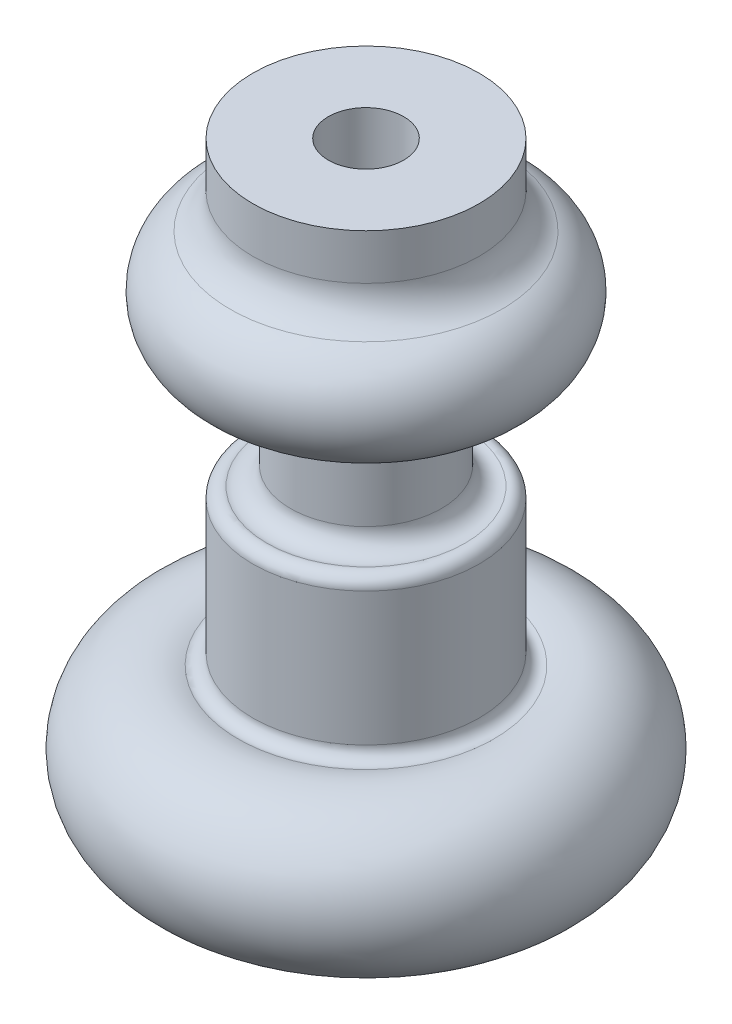
ISO-10303-21;
HEADER;
FILE_DESCRIPTION(('STEP AP214'),'2;1');
FILE_NAME('part.step','',(''),(''),'','','');
FILE_SCHEMA(('AUTOMOTIVE_DESIGN { 1 0 10303 214 1 1 1 1 }'));
ENDSEC;
DATA;
#1=APPLICATION_CONTEXT('core data for automotive mechanical design processes');
#2=APPLICATION_PROTOCOL_DEFINITION('international standard','automotive_design',2000,#1);
#3=PRODUCT_CONTEXT('',#1,'mechanical');
#4=PRODUCT('Part','Part','',(#3));
#5=PRODUCT_RELATED_PRODUCT_CATEGORY('part','',(#4));
#6=PRODUCT_DEFINITION_FORMATION('','',#4);
#7=PRODUCT_DEFINITION_CONTEXT('part definition',#1,'design');
#8=PRODUCT_DEFINITION('design','',#6,#7);
#9=PRODUCT_DEFINITION_SHAPE('','',#8);
#10=(LENGTH_UNIT() NAMED_UNIT(*) SI_UNIT(.MILLI.,.METRE.));
#11=(NAMED_UNIT(*) PLANE_ANGLE_UNIT() SI_UNIT($,.RADIAN.));
#12=(NAMED_UNIT(*) SI_UNIT($,.STERADIAN.) SOLID_ANGLE_UNIT());
#13=UNCERTAINTY_MEASURE_WITH_UNIT(LENGTH_MEASURE(1.E-05),#10,'distance_accuracy_value','');
#14=(GEOMETRIC_REPRESENTATION_CONTEXT(3) GLOBAL_UNCERTAINTY_ASSIGNED_CONTEXT((#13)) GLOBAL_UNIT_ASSIGNED_CONTEXT((#10,
#11,#12)) REPRESENTATION_CONTEXT('',''));
#15=CARTESIAN_POINT('',(0.,0.,0.));
#16=DIRECTION('',(0.,0.,1.));
#17=DIRECTION('',(1.,0.,0.));
#18=AXIS2_PLACEMENT_3D('',#15,#16,#17);
#19=CARTESIAN_POINT('',(0.,0.,0.));
#20=DIRECTION('',(0.,-1.,0.));
#21=DIRECTION('',(0.,0.,-1.));
#22=AXIS2_PLACEMENT_3D('',#19,#20,#21);
#23=PLANE('',#22);
#24=CARTESIAN_POINT('',(0.,0.,0.));
#25=DIRECTION('',(0.,-1.,0.));
#26=DIRECTION('',(0.,0.,-1.));
#27=AXIS2_PLACEMENT_3D('',#24,#25,#26);
#28=CIRCLE('',#27,40.);
#29=CARTESIAN_POINT('',(0.,0.,-40.));
#30=VERTEX_POINT('',#29);
#31=EDGE_CURVE('E10',#30,#30,#28,.T.);
#32=ORIENTED_EDGE('',*,*,#31,.T.);
#33=EDGE_LOOP('',(#32));
#34=FACE_BOUND('',#33,.T.);
#35=ADVANCED_FACE('F35',(#34),#23,.T.);
#36=CARTESIAN_POINT('',(0.,20.,0.));
#37=DIRECTION('',(0.,-1.,0.));
#38=DIRECTION('',(0.,0.,-1.));
#39=AXIS2_PLACEMENT_3D('',#36,#37,#38);
#40=TOROIDAL_SURFACE('',#39,40.,20.);
#41=CARTESIAN_POINT('',(0.,39.0512193914841,0.));
#42=DIRECTION('',(0.,-1.,0.));
#43=DIRECTION('',(0.,0.,-1.));
#44=AXIS2_PLACEMENT_3D('',#41,#42,#43);
#45=CIRCLE('',#44,33.9130434782609);
#46=CARTESIAN_POINT('',(0.,39.0512193914841,-33.9130434782609));
#47=VERTEX_POINT('',#46);
#48=EDGE_CURVE('E41',#47,#47,#45,.T.);
#49=ORIENTED_EDGE('',*,*,#48,.T.);
#50=EDGE_LOOP('',(#49));
#51=FACE_BOUND('',#50,.T.);
#52=ORIENTED_EDGE('',*,*,#31,.F.);
#53=EDGE_LOOP('',(#52));
#54=FACE_BOUND('',#53,.T.);
#55=ADVANCED_FACE('F94',(#51,#54),#40,.T.);
#56=CARTESIAN_POINT('',(0.,41.9089023002067,0.));
#57=DIRECTION('',(0.,-1.,0.));
#58=DIRECTION('',(0.,0.,-1.));
#59=AXIS2_PLACEMENT_3D('',#56,#57,#58);
#60=TOROIDAL_SURFACE('',#59,33.,3.);
#61=CARTESIAN_POINT('',(0.,41.9089023002067,0.));
#62=DIRECTION('',(0.,-1.,0.));
#63=DIRECTION('',(0.,0.,-1.));
#64=AXIS2_PLACEMENT_3D('',#61,#62,#63);
#65=CIRCLE('',#64,30.);
#66=CARTESIAN_POINT('',(0.,41.9089023002067,-30.));
#67=VERTEX_POINT('',#66);
#68=EDGE_CURVE('E45',#67,#67,#65,.T.);
#69=ORIENTED_EDGE('',*,*,#68,.T.);
#70=EDGE_LOOP('',(#69));
#71=FACE_BOUND('',#70,.T.);
#72=ORIENTED_EDGE('',*,*,#48,.F.);
#73=EDGE_LOOP('',(#72));
#74=FACE_BOUND('',#73,.T.);
#75=ADVANCED_FACE('F98',(#71,#74),#60,.F.);
#76=CARTESIAN_POINT('',(0.,0.,0.));
#77=DIRECTION('',(0.,-1.,0.));
#78=DIRECTION('',(0.,0.,-1.));
#79=AXIS2_PLACEMENT_3D('',#76,#77,#78);
#80=CYLINDRICAL_SURFACE('',#79,30.);
#81=CARTESIAN_POINT('',(0.,77.2540333075852,0.));
#82=DIRECTION('',(0.,-1.,0.));
#83=DIRECTION('',(0.,0.,-1.));
#84=AXIS2_PLACEMENT_3D('',#81,#82,#83);
#85=CIRCLE('',#84,30.);
#86=CARTESIAN_POINT('',(0.,77.2540333075852,-30.));
#87=VERTEX_POINT('',#86);
#88=EDGE_CURVE('E49',#87,#87,#85,.T.);
#89=ORIENTED_EDGE('',*,*,#88,.T.);
#90=EDGE_LOOP('',(#89));
#91=FACE_BOUND('',#90,.T.);
#92=ORIENTED_EDGE('',*,*,#68,.F.);
#93=EDGE_LOOP('',(#92));
#94=FACE_BOUND('',#93,.T.);
#95=ADVANCED_FACE('F102',(#91,#94),#80,.T.);
#96=CARTESIAN_POINT('',(0.,77.2540333075852,0.));
#97=DIRECTION('',(0.,-1.,0.));
#98=DIRECTION('',(0.,0.,-1.));
#99=AXIS2_PLACEMENT_3D('',#96,#97,#98);
#100=TOROIDAL_SURFACE('',#99,27.,3.);
#101=CARTESIAN_POINT('',(0.,80.1587708172407,0.));
#102=DIRECTION('',(0.,-1.,0.));
#103=DIRECTION('',(0.,0.,-1.));
#104=AXIS2_PLACEMENT_3D('',#101,#102,#103);
#105=CIRCLE('',#104,26.25);
#106=CARTESIAN_POINT('',(0.,80.1587708172407,-26.25));
#107=VERTEX_POINT('',#106);
#108=EDGE_CURVE('E54',#107,#107,#105,.T.);
#109=ORIENTED_EDGE('',*,*,#108,.T.);
#110=EDGE_LOOP('',(#109));
#111=FACE_BOUND('',#110,.T.);
#112=ORIENTED_EDGE('',*,*,#88,.F.);
#113=EDGE_LOOP('',(#112));
#114=FACE_BOUND('',#113,.T.);
#115=ADVANCED_FACE('F109',(#111,#114),#100,.T.);
#116=CARTESIAN_POINT('',(0.,85.,0.));
#117=DIRECTION('',(0.,-1.,0.));
#118=DIRECTION('',(0.,0.,-1.));
#119=AXIS2_PLACEMENT_3D('',#116,#117,#118);
#120=TOROIDAL_SURFACE('',#119,25.,5.);
#121=CARTESIAN_POINT('',(0.,85.,0.));
#122=DIRECTION('',(0.,-1.,0.));
#123=DIRECTION('',(0.,0.,-1.));
#124=AXIS2_PLACEMENT_3D('',#121,#122,#123);
#125=CIRCLE('',#124,20.);
#126=CARTESIAN_POINT('',(0.,85.,-20.));
#127=VERTEX_POINT('',#126);
#128=EDGE_CURVE('E57',#127,#127,#125,.T.);
#129=ORIENTED_EDGE('',*,*,#128,.T.);
#130=EDGE_LOOP('',(#129));
#131=FACE_BOUND('',#130,.T.);
#132=ORIENTED_EDGE('',*,*,#108,.F.);
#133=EDGE_LOOP('',(#132));
#134=FACE_BOUND('',#133,.T.);
#135=ADVANCED_FACE('F113',(#131,#134),#120,.F.);
#136=CARTESIAN_POINT('',(0.,0.,0.));
#137=DIRECTION('',(0.,-1.,0.));
#138=DIRECTION('',(0.,0.,-1.));
#139=AXIS2_PLACEMENT_3D('',#136,#137,#138);
#140=CYLINDRICAL_SURFACE('',#139,20.);
#141=CARTESIAN_POINT('',(0.,100.,0.));
#142=DIRECTION('',(0.,-1.,0.));
#143=DIRECTION('',(0.,0.,-1.));
#144=AXIS2_PLACEMENT_3D('',#141,#142,#143);
#145=CIRCLE('',#144,20.);
#146=CARTESIAN_POINT('',(0.,100.,-20.));
#147=VERTEX_POINT('',#146);
#148=EDGE_CURVE('E60',#147,#147,#145,.T.);
#149=ORIENTED_EDGE('',*,*,#148,.T.);
#150=EDGE_LOOP('',(#149));
#151=FACE_BOUND('',#150,.T.);
#152=ORIENTED_EDGE('',*,*,#128,.F.);
#153=EDGE_LOOP('',(#152));
#154=FACE_BOUND('',#153,.T.);
#155=ADVANCED_FACE('F117',(#151,#154),#140,.T.);
#156=CARTESIAN_POINT('',(0.,100.,0.));
#157=DIRECTION('',(0.,-1.,0.));
#158=DIRECTION('',(0.,0.,-1.));
#159=AXIS2_PLACEMENT_3D('',#156,#157,#158);
#160=TOROIDAL_SURFACE('',#159,30.,10.);
#161=CARTESIAN_POINT('',(0.,110.,0.));
#162=DIRECTION('',(0.,-1.,0.));
#163=DIRECTION('',(0.,0.,-1.));
#164=AXIS2_PLACEMENT_3D('',#161,#162,#163);
#165=CIRCLE('',#164,30.);
#166=CARTESIAN_POINT('',(0.,110.,-30.));
#167=VERTEX_POINT('',#166);
#168=EDGE_CURVE('E63',#167,#167,#165,.T.);
#169=ORIENTED_EDGE('',*,*,#168,.T.);
#170=EDGE_LOOP('',(#169));
#171=FACE_BOUND('',#170,.T.);
#172=ORIENTED_EDGE('',*,*,#148,.F.);
#173=EDGE_LOOP('',(#172));
#174=FACE_BOUND('',#173,.T.);
#175=ADVANCED_FACE('F121',(#171,#174),#160,.F.);
#176=CARTESIAN_POINT('',(0.,125.,0.));
#177=DIRECTION('',(0.,-1.,0.));
#178=DIRECTION('',(0.,0.,-1.));
#179=AXIS2_PLACEMENT_3D('',#176,#177,#178);
#180=TOROIDAL_SURFACE('',#179,30.,15.);
#181=CARTESIAN_POINT('',(0.,138.747727084868,0.));
#182=DIRECTION('',(0.,-1.,0.));
#183=DIRECTION('',(0.,0.,-1.));
#184=AXIS2_PLACEMENT_3D('',#181,#182,#183);
#185=CIRCLE('',#184,36.);
#186=CARTESIAN_POINT('',(0.,138.747727084868,-36.));
#187=VERTEX_POINT('',#186);
#188=EDGE_CURVE('E66',#187,#187,#185,.T.);
#189=ORIENTED_EDGE('',*,*,#188,.T.);
#190=EDGE_LOOP('',(#189));
#191=FACE_BOUND('',#190,.T.);
#192=ORIENTED_EDGE('',*,*,#168,.F.);
#193=EDGE_LOOP('',(#192));
#194=FACE_BOUND('',#193,.T.);
#195=ADVANCED_FACE('F125',(#191,#194),#180,.T.);
#196=CARTESIAN_POINT('',(0.,147.912878474779,0.));
#197=DIRECTION('',(0.,-1.,0.));
#198=DIRECTION('',(0.,0.,-1.));
#199=AXIS2_PLACEMENT_3D('',#196,#197,#198);
#200=TOROIDAL_SURFACE('',#199,40.,10.);
#201=CARTESIAN_POINT('',(0.,147.912878474779,0.));
#202=DIRECTION('',(0.,-1.,0.));
#203=DIRECTION('',(0.,0.,-1.));
#204=AXIS2_PLACEMENT_3D('',#201,#202,#203);
#205=CIRCLE('',#204,30.);
#206=CARTESIAN_POINT('',(0.,147.912878474779,-30.));
#207=VERTEX_POINT('',#206);
#208=EDGE_CURVE('E69',#207,#207,#205,.T.);
#209=ORIENTED_EDGE('',*,*,#208,.T.);
#210=EDGE_LOOP('',(#209));
#211=FACE_BOUND('',#210,.T.);
#212=ORIENTED_EDGE('',*,*,#188,.F.);
#213=EDGE_LOOP('',(#212));
#214=FACE_BOUND('',#213,.T.);
#215=ADVANCED_FACE('F129',(#211,#214),#200,.F.);
#216=CARTESIAN_POINT('',(0.,0.,0.));
#217=DIRECTION('',(0.,-1.,0.));
#218=DIRECTION('',(0.,0.,-1.));
#219=AXIS2_PLACEMENT_3D('',#216,#217,#218);
#220=CYLINDRICAL_SURFACE('',#219,30.);
#221=CARTESIAN_POINT('',(0.,160.,0.));
#222=DIRECTION('',(0.,-1.,0.));
#223=DIRECTION('',(0.,0.,-1.));
#224=AXIS2_PLACEMENT_3D('',#221,#222,#223);
#225=CIRCLE('',#224,30.);
#226=CARTESIAN_POINT('',(0.,160.,-30.));
#227=VERTEX_POINT('',#226);
#228=EDGE_CURVE('E72',#227,#227,#225,.T.);
#229=ORIENTED_EDGE('',*,*,#228,.T.);
#230=EDGE_LOOP('',(#229));
#231=FACE_BOUND('',#230,.T.);
#232=ORIENTED_EDGE('',*,*,#208,.F.);
#233=EDGE_LOOP('',(#232));
#234=FACE_BOUND('',#233,.T.);
#235=ADVANCED_FACE('F133',(#231,#234),#220,.T.);
#236=CARTESIAN_POINT('',(30.,160.,0.));
#237=DIRECTION('',(0.,1.,0.));
#238=DIRECTION('',(0.,0.,1.));
#239=AXIS2_PLACEMENT_3D('',#236,#237,#238);
#240=PLANE('',#239);
#241=CARTESIAN_POINT('',(0.,160.,0.));
#242=DIRECTION('',(0.,-1.,0.));
#243=DIRECTION('',(0.,0.,-1.));
#244=AXIS2_PLACEMENT_3D('',#241,#242,#243);
#245=CIRCLE('',#244,9.99999999999999);
#246=CARTESIAN_POINT('',(0.,160.,-9.99999999999999));
#247=VERTEX_POINT('',#246);
#248=EDGE_CURVE('E75',#247,#247,#245,.T.);
#249=ORIENTED_EDGE('',*,*,#248,.T.);
#250=EDGE_LOOP('',(#249));
#251=FACE_BOUND('',#250,.T.);
#252=ORIENTED_EDGE('',*,*,#228,.F.);
#253=EDGE_LOOP('',(#252));
#254=FACE_BOUND('',#253,.T.);
#255=ADVANCED_FACE('F91',(#251,#254),#240,.T.);
#256=CARTESIAN_POINT('',(0.,0.,0.));
#257=DIRECTION('',(0.,-1.,0.));
#258=DIRECTION('',(0.,0.,-1.));
#259=AXIS2_PLACEMENT_3D('',#256,#257,#258);
#260=CYLINDRICAL_SURFACE('',#259,10.);
#261=CARTESIAN_POINT('',(0.,120.,0.));
#262=DIRECTION('',(0.,-1.,0.));
#263=DIRECTION('',(0.,0.,-1.));
#264=AXIS2_PLACEMENT_3D('',#261,#262,#263);
#265=CIRCLE('',#264,10.);
#266=CARTESIAN_POINT('',(0.,120.,-10.));
#267=VERTEX_POINT('',#266);
#268=EDGE_CURVE('E78',#267,#267,#265,.T.);
#269=ORIENTED_EDGE('',*,*,#268,.T.);
#270=EDGE_LOOP('',(#269));
#271=FACE_BOUND('',#270,.T.);
#272=ORIENTED_EDGE('',*,*,#248,.F.);
#273=EDGE_LOOP('',(#272));
#274=FACE_BOUND('',#273,.T.);
#275=ADVANCED_FACE('F82',(#271,#274),#260,.F.);
#276=CARTESIAN_POINT('',(10.,120.,0.));
#277=DIRECTION('',(0.,1.,0.));
#278=DIRECTION('',(0.,0.,1.));
#279=AXIS2_PLACEMENT_3D('',#276,#277,#278);
#280=PLANE('',#279);
#281=ORIENTED_EDGE('',*,*,#268,.F.);
#282=EDGE_LOOP('',(#281));
#283=FACE_BOUND('',#282,.T.);
#284=ADVANCED_FACE('F85',(#283),#280,.T.);
#285=CLOSED_SHELL('',(#35,#55,#75,#95,#115,#135,#155,#175,#195,#215,#235,#255,#275,#284));
#286=MANIFOLD_SOLID_BREP('B2',#285);
#287=ADVANCED_BREP_SHAPE_REPRESENTATION('',(#18,#286),#14);
#288=SHAPE_DEFINITION_REPRESENTATION(#9,#287);
ENDSEC;
END-ISO-10303-21;
